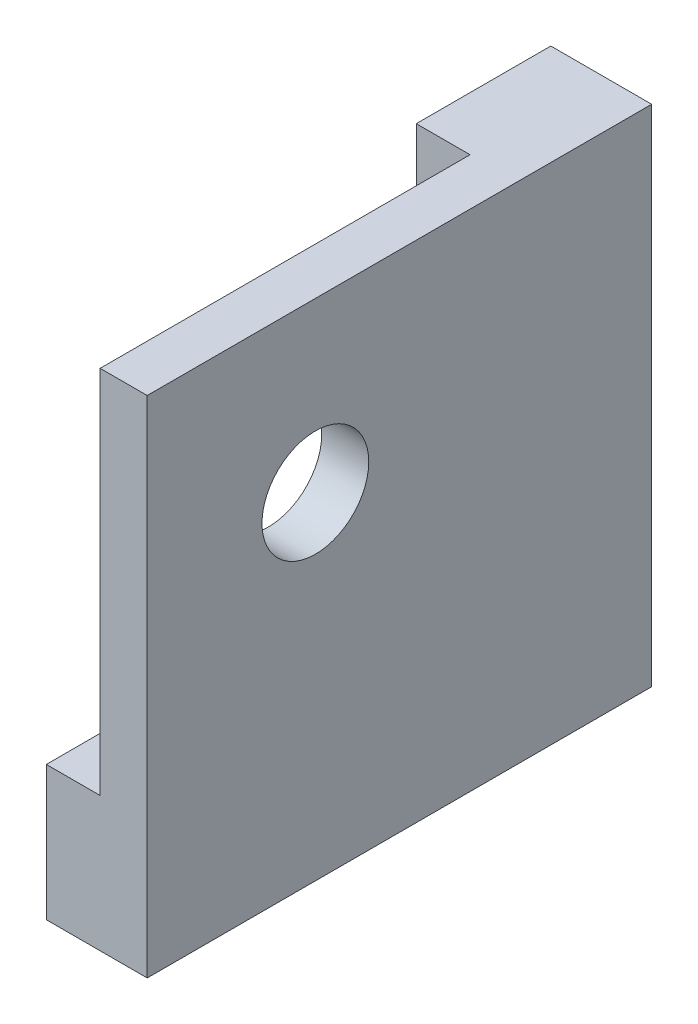
ISO-10303-21;
HEADER;
FILE_DESCRIPTION(('STEP AP214'),'2;1');
FILE_NAME('part.step','',(''),(''),'','','');
FILE_SCHEMA(('AUTOMOTIVE_DESIGN { 1 0 10303 214 1 1 1 1 }'));
ENDSEC;
DATA;
#1=APPLICATION_CONTEXT('core data for automotive mechanical design processes');
#2=APPLICATION_PROTOCOL_DEFINITION('international standard','automotive_design',2000,#1);
#3=PRODUCT_CONTEXT('',#1,'mechanical');
#4=PRODUCT('Part','Part','',(#3));
#5=PRODUCT_RELATED_PRODUCT_CATEGORY('part','',(#4));
#6=PRODUCT_DEFINITION_FORMATION('','',#4);
#7=PRODUCT_DEFINITION_CONTEXT('part definition',#1,'design');
#8=PRODUCT_DEFINITION('design','',#6,#7);
#9=PRODUCT_DEFINITION_SHAPE('','',#8);
#10=(LENGTH_UNIT() NAMED_UNIT(*) SI_UNIT(.MILLI.,.METRE.));
#11=(NAMED_UNIT(*) PLANE_ANGLE_UNIT() SI_UNIT($,.RADIAN.));
#12=(NAMED_UNIT(*) SI_UNIT($,.STERADIAN.) SOLID_ANGLE_UNIT());
#13=UNCERTAINTY_MEASURE_WITH_UNIT(LENGTH_MEASURE(1.E-05),#10,'distance_accuracy_value','');
#14=(GEOMETRIC_REPRESENTATION_CONTEXT(3) GLOBAL_UNCERTAINTY_ASSIGNED_CONTEXT((#13)) GLOBAL_UNIT_ASSIGNED_CONTEXT((#10,
#11,#12)) REPRESENTATION_CONTEXT('',''));
#15=CARTESIAN_POINT('',(0.,0.,0.));
#16=DIRECTION('',(0.,0.,1.));
#17=DIRECTION('',(1.,0.,0.));
#18=AXIS2_PLACEMENT_3D('',#15,#16,#17);
#19=CARTESIAN_POINT('',(6.,0.,0.));
#20=DIRECTION('',(0.,1.,0.));
#21=DIRECTION('',(0.,0.,1.));
#22=AXIS2_PLACEMENT_3D('',#19,#20,#21);
#23=PLANE('',#22);
#24=DIRECTION('',(0.,0.,-1.));
#25=VECTOR('',#24,1.);
#26=CARTESIAN_POINT('',(0.,0.,0.));
#27=LINE('',#26,#25);
#28=CARTESIAN_POINT('',(0.,0.,-22.));
#29=VERTEX_POINT('',#28);
#30=CARTESIAN_POINT('',(0.,0.,-30.));
#31=VERTEX_POINT('',#30);
#32=EDGE_CURVE('E179',#29,#31,#27,.T.);
#33=ORIENTED_EDGE('',*,*,#32,.F.);
#34=DIRECTION('',(1.,0.,0.));
#35=VECTOR('',#34,1.);
#36=CARTESIAN_POINT('',(-53.5607132140714,0.,-22.));
#37=LINE('',#36,#35);
#38=CARTESIAN_POINT('',(3.2,0.,-22.));
#39=VERTEX_POINT('',#38);
#40=EDGE_CURVE('E63',#29,#39,#37,.T.);
#41=ORIENTED_EDGE('',*,*,#40,.T.);
#42=DIRECTION('',(0.,0.,-1.));
#43=VECTOR('',#42,1.);
#44=CARTESIAN_POINT('',(3.2,0.,0.));
#45=LINE('',#44,#43);
#46=CARTESIAN_POINT('',(3.2,0.,0.));
#47=VERTEX_POINT('',#46);
#48=EDGE_CURVE('E126',#47,#39,#45,.T.);
#49=ORIENTED_EDGE('',*,*,#48,.F.);
#50=DIRECTION('',(-1.,0.,0.));
#51=VECTOR('',#50,1.);
#52=CARTESIAN_POINT('',(6.,0.,0.));
#53=LINE('',#52,#51);
#54=CARTESIAN_POINT('',(6.,0.,0.));
#55=VERTEX_POINT('',#54);
#56=EDGE_CURVE('E187',#55,#47,#53,.T.);
#57=ORIENTED_EDGE('',*,*,#56,.F.);
#58=DIRECTION('',(0.,0.,-1.));
#59=VECTOR('',#58,1.);
#60=CARTESIAN_POINT('',(6.,0.,0.));
#61=LINE('',#60,#59);
#62=CARTESIAN_POINT('',(6.,0.,-30.));
#63=VERTEX_POINT('',#62);
#64=EDGE_CURVE('E168',#55,#63,#61,.T.);
#65=ORIENTED_EDGE('',*,*,#64,.T.);
#66=DIRECTION('',(-1.,0.,0.));
#67=VECTOR('',#66,1.);
#68=CARTESIAN_POINT('',(6.,0.,-30.));
#69=LINE('',#68,#67);
#70=EDGE_CURVE('E190',#63,#31,#69,.T.);
#71=ORIENTED_EDGE('',*,*,#70,.T.);
#72=EDGE_LOOP('',(#33,#41,#49,#57,#65,#71));
#73=FACE_BOUND('',#72,.T.);
#74=ADVANCED_FACE('F47',(#73),#23,.T.);
#75=CARTESIAN_POINT('',(6.,0.,0.));
#76=DIRECTION('',(0.,0.,-1.));
#77=DIRECTION('',(0.,1.,0.));
#78=AXIS2_PLACEMENT_3D('',#75,#76,#77);
#79=PLANE('',#78);
#80=DIRECTION('',(1.,0.,0.));
#81=VECTOR('',#80,1.);
#82=CARTESIAN_POINT('',(-53.5607132140714,-22.,0.));
#83=LINE('',#82,#81);
#84=CARTESIAN_POINT('',(0.,-22.,0.));
#85=VERTEX_POINT('',#84);
#86=CARTESIAN_POINT('',(3.2,-22.,0.));
#87=VERTEX_POINT('',#86);
#88=EDGE_CURVE('E144',#85,#87,#83,.T.);
#89=ORIENTED_EDGE('',*,*,#88,.F.);
#90=DIRECTION('',(0.,-1.,0.));
#91=VECTOR('',#90,1.);
#92=CARTESIAN_POINT('',(0.,0.,0.));
#93=LINE('',#92,#91);
#94=CARTESIAN_POINT('',(0.,-30.,0.));
#95=VERTEX_POINT('',#94);
#96=EDGE_CURVE('E121',#85,#95,#93,.T.);
#97=ORIENTED_EDGE('',*,*,#96,.T.);
#98=DIRECTION('',(-1.,0.,0.));
#99=VECTOR('',#98,1.);
#100=CARTESIAN_POINT('',(6.,-30.,0.));
#101=LINE('',#100,#99);
#102=CARTESIAN_POINT('',(6.,-30.,0.));
#103=VERTEX_POINT('',#102);
#104=EDGE_CURVE('E174',#103,#95,#101,.T.);
#105=ORIENTED_EDGE('',*,*,#104,.F.);
#106=DIRECTION('',(0.,-1.,0.));
#107=VECTOR('',#106,1.);
#108=CARTESIAN_POINT('',(6.,0.,0.));
#109=LINE('',#108,#107);
#110=EDGE_CURVE('E172',#55,#103,#109,.T.);
#111=ORIENTED_EDGE('',*,*,#110,.F.);
#112=ORIENTED_EDGE('',*,*,#56,.T.);
#113=DIRECTION('',(0.,-1.,0.));
#114=VECTOR('',#113,1.);
#115=CARTESIAN_POINT('',(3.2,0.,0.));
#116=LINE('',#115,#114);
#117=EDGE_CURVE('E71',#47,#87,#116,.T.);
#118=ORIENTED_EDGE('',*,*,#117,.T.);
#119=EDGE_LOOP('',(#89,#97,#105,#111,#112,#118));
#120=FACE_BOUND('',#119,.T.);
#121=ADVANCED_FACE('F205',(#120),#79,.F.);
#122=CARTESIAN_POINT('',(0.,0.,0.));
#123=DIRECTION('',(1.,0.,0.));
#124=DIRECTION('',(0.,0.,-1.));
#125=AXIS2_PLACEMENT_3D('',#122,#123,#124);
#126=PLANE('',#125);
#127=ORIENTED_EDGE('',*,*,#96,.F.);
#128=DIRECTION('',(0.,0.,-1.));
#129=VECTOR('',#128,1.);
#130=CARTESIAN_POINT('',(0.,-22.,-10.));
#131=LINE('',#130,#129);
#132=CARTESIAN_POINT('',(0.,-22.,-10.));
#133=VERTEX_POINT('',#132);
#134=EDGE_CURVE('E115',#85,#133,#131,.T.);
#135=ORIENTED_EDGE('',*,*,#134,.T.);
#136=CARTESIAN_POINT('',(0.,-10.,-10.));
#137=DIRECTION('',(1.,0.,0.));
#138=DIRECTION('',(0.,0.,-1.));
#139=AXIS2_PLACEMENT_3D('',#136,#137,#138);
#140=CIRCLE('',#139,12.);
#141=CARTESIAN_POINT('',(0.,-10.,-22.));
#142=VERTEX_POINT('',#141);
#143=EDGE_CURVE('E118',#133,#142,#140,.T.);
#144=ORIENTED_EDGE('',*,*,#143,.T.);
#145=DIRECTION('',(0.,1.,0.));
#146=VECTOR('',#145,1.);
#147=CARTESIAN_POINT('',(0.,-10.,-22.));
#148=LINE('',#147,#146);
#149=EDGE_CURVE('E137',#142,#29,#148,.T.);
#150=ORIENTED_EDGE('',*,*,#149,.T.);
#151=ORIENTED_EDGE('',*,*,#32,.T.);
#152=DIRECTION('',(0.,1.,0.));
#153=VECTOR('',#152,1.);
#154=CARTESIAN_POINT('',(0.,0.,-30.));
#155=LINE('',#154,#153);
#156=CARTESIAN_POINT('',(0.,-30.,-30.));
#157=VERTEX_POINT('',#156);
#158=EDGE_CURVE('E148',#157,#31,#155,.T.);
#159=ORIENTED_EDGE('',*,*,#158,.F.);
#160=DIRECTION('',(0.,0.,1.));
#161=VECTOR('',#160,1.);
#162=CARTESIAN_POINT('',(0.,-30.,0.));
#163=LINE('',#162,#161);
#164=EDGE_CURVE('E143',#157,#95,#163,.T.);
#165=ORIENTED_EDGE('',*,*,#164,.T.);
#166=EDGE_LOOP('',(#127,#135,#144,#150,#151,#159,#165));
#167=FACE_BOUND('',#166,.T.);
#168=ADVANCED_FACE('F117',(#167),#126,.F.);
#169=CARTESIAN_POINT('',(6.,-30.,0.));
#170=DIRECTION('',(0.,-1.,0.));
#171=DIRECTION('',(0.,0.,-1.));
#172=AXIS2_PLACEMENT_3D('',#169,#170,#171);
#173=PLANE('',#172);
#174=ORIENTED_EDGE('',*,*,#164,.F.);
#175=DIRECTION('',(-1.,0.,0.));
#176=VECTOR('',#175,1.);
#177=CARTESIAN_POINT('',(6.,-30.,-30.));
#178=LINE('',#177,#176);
#179=CARTESIAN_POINT('',(6.,-30.,-30.));
#180=VERTEX_POINT('',#179);
#181=EDGE_CURVE('E56',#180,#157,#178,.T.);
#182=ORIENTED_EDGE('',*,*,#181,.F.);
#183=DIRECTION('',(0.,0.,1.));
#184=VECTOR('',#183,1.);
#185=CARTESIAN_POINT('',(6.,-30.,0.));
#186=LINE('',#185,#184);
#187=EDGE_CURVE('E161',#180,#103,#186,.T.);
#188=ORIENTED_EDGE('',*,*,#187,.T.);
#189=ORIENTED_EDGE('',*,*,#104,.T.);
#190=EDGE_LOOP('',(#174,#182,#188,#189));
#191=FACE_BOUND('',#190,.T.);
#192=ADVANCED_FACE('F202',(#191),#173,.T.);
#193=CARTESIAN_POINT('',(6.,0.,-30.));
#194=DIRECTION('',(0.,0.,1.));
#195=DIRECTION('',(0.,-1.,0.));
#196=AXIS2_PLACEMENT_3D('',#193,#194,#195);
#197=PLANE('',#196);
#198=ORIENTED_EDGE('',*,*,#158,.T.);
#199=ORIENTED_EDGE('',*,*,#70,.F.);
#200=DIRECTION('',(0.,1.,0.));
#201=VECTOR('',#200,1.);
#202=CARTESIAN_POINT('',(6.,0.,-30.));
#203=LINE('',#202,#201);
#204=EDGE_CURVE('E165',#180,#63,#203,.T.);
#205=ORIENTED_EDGE('',*,*,#204,.F.);
#206=ORIENTED_EDGE('',*,*,#181,.T.);
#207=EDGE_LOOP('',(#198,#199,#205,#206));
#208=FACE_BOUND('',#207,.T.);
#209=ADVANCED_FACE('F197',(#208),#197,.F.);
#210=CARTESIAN_POINT('',(6.,-10.,-10.));
#211=DIRECTION('',(-1.,0.,0.));
#212=DIRECTION('',(0.,0.,1.));
#213=AXIS2_PLACEMENT_3D('',#210,#211,#212);
#214=CYLINDRICAL_SURFACE('',#213,3.175);
#215=CARTESIAN_POINT('',(3.2,-10.,-10.));
#216=DIRECTION('',(1.,0.,0.));
#217=DIRECTION('',(0.,0.,-1.));
#218=AXIS2_PLACEMENT_3D('',#215,#216,#217);
#219=CIRCLE('',#218,3.175);
#220=CARTESIAN_POINT('',(3.2,-10.,-13.175));
#221=VERTEX_POINT('',#220);
#222=EDGE_CURVE('E11',#221,#221,#219,.T.);
#223=ORIENTED_EDGE('',*,*,#222,.F.);
#224=EDGE_LOOP('',(#223));
#225=FACE_BOUND('',#224,.T.);
#226=CARTESIAN_POINT('',(6.,-10.,-10.));
#227=DIRECTION('',(1.,0.,0.));
#228=DIRECTION('',(0.,0.,-1.));
#229=AXIS2_PLACEMENT_3D('',#226,#227,#228);
#230=CIRCLE('',#229,3.175);
#231=CARTESIAN_POINT('',(6.,-10.,-13.175));
#232=VERTEX_POINT('',#231);
#233=EDGE_CURVE('E157',#232,#232,#230,.T.);
#234=ORIENTED_EDGE('',*,*,#233,.T.);
#235=EDGE_LOOP('',(#234));
#236=FACE_BOUND('',#235,.T.);
#237=ADVANCED_FACE('F49',(#225,#236),#214,.F.);
#238=CARTESIAN_POINT('',(6.,0.,0.));
#239=DIRECTION('',(1.,0.,0.));
#240=DIRECTION('',(0.,0.,-1.));
#241=AXIS2_PLACEMENT_3D('',#238,#239,#240);
#242=PLANE('',#241);
#243=ORIENTED_EDGE('',*,*,#233,.F.);
#244=EDGE_LOOP('',(#243));
#245=FACE_BOUND('',#244,.T.);
#246=ORIENTED_EDGE('',*,*,#187,.F.);
#247=ORIENTED_EDGE('',*,*,#204,.T.);
#248=ORIENTED_EDGE('',*,*,#64,.F.);
#249=ORIENTED_EDGE('',*,*,#110,.T.);
#250=EDGE_LOOP('',(#246,#247,#248,#249));
#251=FACE_BOUND('',#250,.T.);
#252=ADVANCED_FACE('F208',(#245,#251),#242,.T.);
#253=CARTESIAN_POINT('',(-53.5607132140714,-22.,-10.));
#254=DIRECTION('',(0.,1.,0.));
#255=DIRECTION('',(0.,0.,1.));
#256=AXIS2_PLACEMENT_3D('',#253,#254,#255);
#257=PLANE('',#256);
#258=ORIENTED_EDGE('',*,*,#134,.F.);
#259=ORIENTED_EDGE('',*,*,#88,.T.);
#260=DIRECTION('',(0.,0.,-1.));
#261=VECTOR('',#260,1.);
#262=CARTESIAN_POINT('',(3.2,-22.,-10.));
#263=LINE('',#262,#261);
#264=CARTESIAN_POINT('',(3.2,-22.,-10.));
#265=VERTEX_POINT('',#264);
#266=EDGE_CURVE('E141',#87,#265,#263,.T.);
#267=ORIENTED_EDGE('',*,*,#266,.T.);
#268=DIRECTION('',(1.,0.,0.));
#269=VECTOR('',#268,1.);
#270=CARTESIAN_POINT('',(-53.5607132140714,-22.,-10.));
#271=LINE('',#270,#269);
#272=EDGE_CURVE('E133',#133,#265,#271,.T.);
#273=ORIENTED_EDGE('',*,*,#272,.F.);
#274=EDGE_LOOP('',(#258,#259,#267,#273));
#275=FACE_BOUND('',#274,.T.);
#276=ADVANCED_FACE('F140',(#275),#257,.T.);
#277=CARTESIAN_POINT('',(-53.5607132140714,-10.,-10.));
#278=DIRECTION('',(1.,0.,0.));
#279=DIRECTION('',(0.,0.,-1.));
#280=AXIS2_PLACEMENT_3D('',#277,#278,#279);
#281=CYLINDRICAL_SURFACE('',#280,12.);
#282=ORIENTED_EDGE('',*,*,#143,.F.);
#283=ORIENTED_EDGE('',*,*,#272,.T.);
#284=CARTESIAN_POINT('',(3.2,-10.,-10.));
#285=DIRECTION('',(1.,0.,0.));
#286=DIRECTION('',(0.,0.,-1.));
#287=AXIS2_PLACEMENT_3D('',#284,#285,#286);
#288=CIRCLE('',#287,12.);
#289=CARTESIAN_POINT('',(3.2,-10.,-22.));
#290=VERTEX_POINT('',#289);
#291=EDGE_CURVE('E216',#265,#290,#288,.T.);
#292=ORIENTED_EDGE('',*,*,#291,.T.);
#293=DIRECTION('',(1.,0.,0.));
#294=VECTOR('',#293,1.);
#295=CARTESIAN_POINT('',(-53.5607132140714,-10.,-22.));
#296=LINE('',#295,#294);
#297=EDGE_CURVE('E135',#142,#290,#296,.T.);
#298=ORIENTED_EDGE('',*,*,#297,.F.);
#299=EDGE_LOOP('',(#282,#283,#292,#298));
#300=FACE_BOUND('',#299,.T.);
#301=ADVANCED_FACE('F131',(#300),#281,.F.);
#302=CARTESIAN_POINT('',(-53.5607132140714,-10.,-22.));
#303=DIRECTION('',(0.,0.,1.));
#304=DIRECTION('',(1.,0.,0.));
#305=AXIS2_PLACEMENT_3D('',#302,#303,#304);
#306=PLANE('',#305);
#307=ORIENTED_EDGE('',*,*,#149,.F.);
#308=ORIENTED_EDGE('',*,*,#297,.T.);
#309=DIRECTION('',(0.,1.,0.));
#310=VECTOR('',#309,1.);
#311=CARTESIAN_POINT('',(3.2,-10.,-22.));
#312=LINE('',#311,#310);
#313=EDGE_CURVE('E212',#290,#39,#312,.T.);
#314=ORIENTED_EDGE('',*,*,#313,.T.);
#315=ORIENTED_EDGE('',*,*,#40,.F.);
#316=EDGE_LOOP('',(#307,#308,#314,#315));
#317=FACE_BOUND('',#316,.T.);
#318=ADVANCED_FACE('F214',(#317),#306,.T.);
#319=CARTESIAN_POINT('',(3.2,0.,0.));
#320=DIRECTION('',(1.,0.,0.));
#321=DIRECTION('',(0.,0.,-1.));
#322=AXIS2_PLACEMENT_3D('',#319,#320,#321);
#323=PLANE('',#322);
#324=ORIENTED_EDGE('',*,*,#222,.T.);
#325=EDGE_LOOP('',(#324));
#326=FACE_BOUND('',#325,.T.);
#327=ORIENTED_EDGE('',*,*,#48,.T.);
#328=ORIENTED_EDGE('',*,*,#313,.F.);
#329=ORIENTED_EDGE('',*,*,#291,.F.);
#330=ORIENTED_EDGE('',*,*,#266,.F.);
#331=ORIENTED_EDGE('',*,*,#117,.F.);
#332=EDGE_LOOP('',(#327,#328,#329,#330,#331));
#333=FACE_BOUND('',#332,.T.);
#334=ADVANCED_FACE('F211',(#326,#333),#323,.F.);
#335=CLOSED_SHELL('',(#74,#121,#168,#192,#209,#237,#252,#276,#301,#318,#334));
#336=MANIFOLD_SOLID_BREP('B2',#335);
#337=ADVANCED_BREP_SHAPE_REPRESENTATION('',(#18,#336),#14);
#338=SHAPE_DEFINITION_REPRESENTATION(#9,#337);
ENDSEC;
END-ISO-10303-21;
